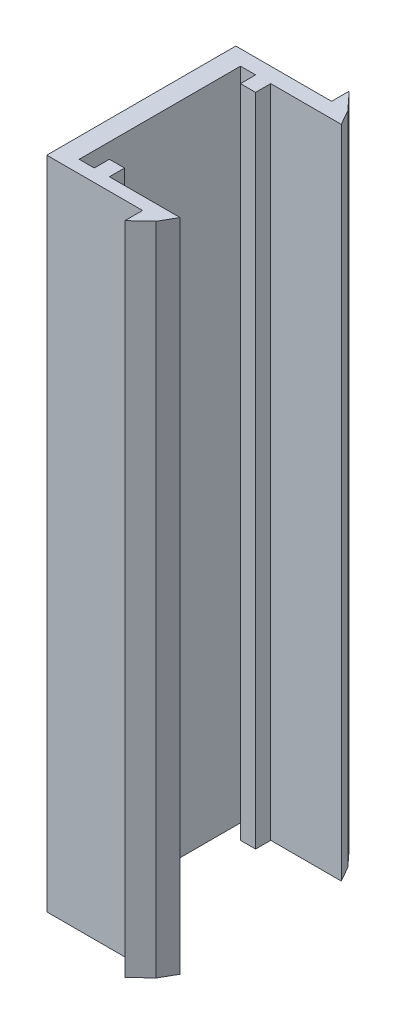
ISO-10303-21;
HEADER;
FILE_DESCRIPTION(('STEP AP214'),'2;1');
FILE_NAME('part.step','',(''),(''),'','','');
FILE_SCHEMA(('AUTOMOTIVE_DESIGN { 1 0 10303 214 1 1 1 1 }'));
ENDSEC;
DATA;
#1=APPLICATION_CONTEXT('core data for automotive mechanical design processes');
#2=APPLICATION_PROTOCOL_DEFINITION('international standard','automotive_design',2000,#1);
#3=PRODUCT_CONTEXT('',#1,'mechanical');
#4=PRODUCT('Part','Part','',(#3));
#5=PRODUCT_RELATED_PRODUCT_CATEGORY('part','',(#4));
#6=PRODUCT_DEFINITION_FORMATION('','',#4);
#7=PRODUCT_DEFINITION_CONTEXT('part definition',#1,'design');
#8=PRODUCT_DEFINITION('design','',#6,#7);
#9=PRODUCT_DEFINITION_SHAPE('','',#8);
#10=(LENGTH_UNIT() NAMED_UNIT(*) SI_UNIT(.MILLI.,.METRE.));
#11=(NAMED_UNIT(*) PLANE_ANGLE_UNIT() SI_UNIT($,.RADIAN.));
#12=(NAMED_UNIT(*) SI_UNIT($,.STERADIAN.) SOLID_ANGLE_UNIT());
#13=UNCERTAINTY_MEASURE_WITH_UNIT(LENGTH_MEASURE(1.E-05),#10,'distance_accuracy_value','');
#14=(GEOMETRIC_REPRESENTATION_CONTEXT(3) GLOBAL_UNCERTAINTY_ASSIGNED_CONTEXT((#13)) GLOBAL_UNIT_ASSIGNED_CONTEXT((#10,
#11,#12)) REPRESENTATION_CONTEXT('',''));
#15=CARTESIAN_POINT('',(0.,0.,0.));
#16=DIRECTION('',(0.,0.,1.));
#17=DIRECTION('',(1.,0.,0.));
#18=AXIS2_PLACEMENT_3D('',#15,#16,#17);
#19=CARTESIAN_POINT('',(3.,130.,-29.));
#20=DIRECTION('',(1.,0.,0.));
#21=DIRECTION('',(0.,0.,-1.));
#22=AXIS2_PLACEMENT_3D('',#19,#20,#21);
#23=PLANE('',#22);
#24=DIRECTION('',(0.,0.,1.));
#25=VECTOR('',#24,1.);
#26=CARTESIAN_POINT('',(3.,0.,-29.));
#27=LINE('',#26,#25);
#28=CARTESIAN_POINT('',(3.,0.,-29.));
#29=VERTEX_POINT('',#28);
#30=CARTESIAN_POINT('',(3.,0.,-26.));
#31=VERTEX_POINT('',#30);
#32=EDGE_CURVE('E203',#29,#31,#27,.T.);
#33=ORIENTED_EDGE('',*,*,#32,.T.);
#34=DIRECTION('',(0.,-1.,0.));
#35=VECTOR('',#34,1.);
#36=CARTESIAN_POINT('',(3.,130.,-26.));
#37=LINE('',#36,#35);
#38=CARTESIAN_POINT('',(3.,130.,-26.));
#39=VERTEX_POINT('',#38);
#40=EDGE_CURVE('E11',#39,#31,#37,.T.);
#41=ORIENTED_EDGE('',*,*,#40,.F.);
#42=DIRECTION('',(0.,0.,1.));
#43=VECTOR('',#42,1.);
#44=CARTESIAN_POINT('',(3.,130.,-29.));
#45=LINE('',#44,#43);
#46=CARTESIAN_POINT('',(3.,130.,-29.));
#47=VERTEX_POINT('',#46);
#48=EDGE_CURVE('E241',#47,#39,#45,.T.);
#49=ORIENTED_EDGE('',*,*,#48,.F.);
#50=DIRECTION('',(0.,-1.,0.));
#51=VECTOR('',#50,1.);
#52=CARTESIAN_POINT('',(3.,130.,-29.));
#53=LINE('',#52,#51);
#54=EDGE_CURVE('E199',#47,#29,#53,.T.);
#55=ORIENTED_EDGE('',*,*,#54,.T.);
#56=EDGE_LOOP('',(#33,#41,#49,#55));
#57=FACE_BOUND('',#56,.T.);
#58=ADVANCED_FACE('F35',(#57),#23,.F.);
#59=CARTESIAN_POINT('',(3.,130.,-26.));
#60=DIRECTION('',(0.,0.,-1.));
#61=DIRECTION('',(-1.,0.,0.));
#62=AXIS2_PLACEMENT_3D('',#59,#60,#61);
#63=PLANE('',#62);
#64=DIRECTION('',(1.,0.,0.));
#65=VECTOR('',#64,1.);
#66=CARTESIAN_POINT('',(3.,0.,-26.));
#67=LINE('',#66,#65);
#68=CARTESIAN_POINT('',(6.,0.,-26.));
#69=VERTEX_POINT('',#68);
#70=EDGE_CURVE('E206',#31,#69,#67,.T.);
#71=ORIENTED_EDGE('',*,*,#70,.T.);
#72=DIRECTION('',(0.,-1.,0.));
#73=VECTOR('',#72,1.);
#74=CARTESIAN_POINT('',(6.,130.,-26.));
#75=LINE('',#74,#73);
#76=CARTESIAN_POINT('',(6.,130.,-26.));
#77=VERTEX_POINT('',#76);
#78=EDGE_CURVE('E43',#77,#69,#75,.T.);
#79=ORIENTED_EDGE('',*,*,#78,.F.);
#80=DIRECTION('',(1.,0.,0.));
#81=VECTOR('',#80,1.);
#82=CARTESIAN_POINT('',(3.,130.,-26.));
#83=LINE('',#82,#81);
#84=EDGE_CURVE('E130',#39,#77,#83,.T.);
#85=ORIENTED_EDGE('',*,*,#84,.F.);
#86=ORIENTED_EDGE('',*,*,#40,.T.);
#87=EDGE_LOOP('',(#71,#79,#85,#86));
#88=FACE_BOUND('',#87,.T.);
#89=ADVANCED_FACE('F359',(#88),#63,.F.);
#90=CARTESIAN_POINT('',(6.,130.,-26.));
#91=DIRECTION('',(-1.,0.,0.));
#92=DIRECTION('',(0.,0.,1.));
#93=AXIS2_PLACEMENT_3D('',#90,#91,#92);
#94=PLANE('',#93);
#95=DIRECTION('',(0.,0.,-1.));
#96=VECTOR('',#95,1.);
#97=CARTESIAN_POINT('',(6.,0.,-26.));
#98=LINE('',#97,#96);
#99=CARTESIAN_POINT('',(6.,0.,-29.));
#100=VERTEX_POINT('',#99);
#101=EDGE_CURVE('E208',#69,#100,#98,.T.);
#102=ORIENTED_EDGE('',*,*,#101,.T.);
#103=DIRECTION('',(0.,-1.,0.));
#104=VECTOR('',#103,1.);
#105=CARTESIAN_POINT('',(6.,130.,-29.));
#106=LINE('',#105,#104);
#107=CARTESIAN_POINT('',(6.,130.,-29.));
#108=VERTEX_POINT('',#107);
#109=EDGE_CURVE('E284',#108,#100,#106,.T.);
#110=ORIENTED_EDGE('',*,*,#109,.F.);
#111=DIRECTION('',(0.,0.,-1.));
#112=VECTOR('',#111,1.);
#113=CARTESIAN_POINT('',(6.,130.,-26.));
#114=LINE('',#113,#112);
#115=EDGE_CURVE('E292',#77,#108,#114,.T.);
#116=ORIENTED_EDGE('',*,*,#115,.F.);
#117=ORIENTED_EDGE('',*,*,#78,.T.);
#118=EDGE_LOOP('',(#102,#110,#116,#117));
#119=FACE_BOUND('',#118,.T.);
#120=ADVANCED_FACE('F290',(#119),#94,.F.);
#121=CARTESIAN_POINT('',(6.,130.,-29.));
#122=DIRECTION('',(0.,0.,-1.));
#123=DIRECTION('',(-1.,0.,0.));
#124=AXIS2_PLACEMENT_3D('',#121,#122,#123);
#125=PLANE('',#124);
#126=DIRECTION('',(1.,0.,0.));
#127=VECTOR('',#126,1.);
#128=CARTESIAN_POINT('',(6.,0.,-29.));
#129=LINE('',#128,#127);
#130=CARTESIAN_POINT('',(20.,0.,-29.));
#131=VERTEX_POINT('',#130);
#132=EDGE_CURVE('E210',#100,#131,#129,.T.);
#133=ORIENTED_EDGE('',*,*,#132,.T.);
#134=DIRECTION('',(0.,-1.,0.));
#135=VECTOR('',#134,1.);
#136=CARTESIAN_POINT('',(20.,130.,-29.));
#137=LINE('',#136,#135);
#138=CARTESIAN_POINT('',(20.,130.,-29.));
#139=VERTEX_POINT('',#138);
#140=EDGE_CURVE('E281',#139,#131,#137,.T.);
#141=ORIENTED_EDGE('',*,*,#140,.F.);
#142=DIRECTION('',(1.,0.,0.));
#143=VECTOR('',#142,1.);
#144=CARTESIAN_POINT('',(6.,130.,-29.));
#145=LINE('',#144,#143);
#146=EDGE_CURVE('E310',#108,#139,#145,.T.);
#147=ORIENTED_EDGE('',*,*,#146,.F.);
#148=ORIENTED_EDGE('',*,*,#109,.T.);
#149=EDGE_LOOP('',(#133,#141,#147,#148));
#150=FACE_BOUND('',#149,.T.);
#151=ADVANCED_FACE('F301',(#150),#125,.F.);
#152=CARTESIAN_POINT('',(18.2906223594552,130.,-32.));
#153=DIRECTION('',(-0.868854805469174,0.,0.495066992449631));
#154=DIRECTION('',(0.495066992449631,0.,0.868854805469174));
#155=AXIS2_PLACEMENT_3D('',#152,#153,#154);
#156=PLANE('',#155);
#157=DIRECTION('',(-0.495066992449631,0.,-0.868854805469174));
#158=VECTOR('',#157,1.);
#159=CARTESIAN_POINT('',(18.2906223594552,0.,-32.));
#160=LINE('',#159,#158);
#161=CARTESIAN_POINT('',(18.2906223594552,0.,-32.));
#162=VERTEX_POINT('',#161);
#163=EDGE_CURVE('E212',#131,#162,#160,.T.);
#164=ORIENTED_EDGE('',*,*,#163,.T.);
#165=DIRECTION('',(0.,-1.,0.));
#166=VECTOR('',#165,1.);
#167=CARTESIAN_POINT('',(18.2906223594552,130.,-32.));
#168=LINE('',#167,#166);
#169=CARTESIAN_POINT('',(18.2906223594552,130.,-32.));
#170=VERTEX_POINT('',#169);
#171=EDGE_CURVE('E278',#170,#162,#168,.T.);
#172=ORIENTED_EDGE('',*,*,#171,.F.);
#173=DIRECTION('',(-0.495066992449631,0.,-0.868854805469174));
#174=VECTOR('',#173,1.);
#175=CARTESIAN_POINT('',(18.2906223594552,130.,-32.));
#176=LINE('',#175,#174);
#177=EDGE_CURVE('E307',#139,#170,#176,.T.);
#178=ORIENTED_EDGE('',*,*,#177,.F.);
#179=ORIENTED_EDGE('',*,*,#140,.T.);
#180=EDGE_LOOP('',(#164,#172,#178,#179));
#181=FACE_BOUND('',#180,.T.);
#182=ADVANCED_FACE('F305',(#181),#156,.F.);
#183=CARTESIAN_POINT('',(15.0753550566551,130.,-35.5));
#184=DIRECTION('',(-0.736426986320433,0.,0.676517031433063));
#185=DIRECTION('',(0.676517031433063,0.,0.736426986320433));
#186=AXIS2_PLACEMENT_3D('',#183,#184,#185);
#187=PLANE('',#186);
#188=DIRECTION('',(-0.676517031433063,0.,-0.736426986320433));
#189=VECTOR('',#188,1.);
#190=CARTESIAN_POINT('',(15.0753550566551,0.,-35.5));
#191=LINE('',#190,#189);
#192=CARTESIAN_POINT('',(15.0753550566551,0.,-35.5));
#193=VERTEX_POINT('',#192);
#194=EDGE_CURVE('E214',#162,#193,#191,.T.);
#195=ORIENTED_EDGE('',*,*,#194,.T.);
#196=DIRECTION('',(0.,-1.,0.));
#197=VECTOR('',#196,1.);
#198=CARTESIAN_POINT('',(15.0753550566551,130.,-35.5));
#199=LINE('',#198,#197);
#200=CARTESIAN_POINT('',(15.0753550566551,130.,-35.5));
#201=VERTEX_POINT('',#200);
#202=EDGE_CURVE('E275',#201,#193,#199,.T.);
#203=ORIENTED_EDGE('',*,*,#202,.F.);
#204=DIRECTION('',(-0.676517031433063,0.,-0.736426986320433));
#205=VECTOR('',#204,1.);
#206=CARTESIAN_POINT('',(15.0753550566551,130.,-35.5));
#207=LINE('',#206,#205);
#208=EDGE_CURVE('E309',#170,#201,#207,.T.);
#209=ORIENTED_EDGE('',*,*,#208,.F.);
#210=ORIENTED_EDGE('',*,*,#171,.T.);
#211=EDGE_LOOP('',(#195,#203,#209,#210));
#212=FACE_BOUND('',#211,.T.);
#213=ADVANCED_FACE('F372',(#212),#187,.F.);
#214=CARTESIAN_POINT('',(15.0753550566551,130.,-32.));
#215=DIRECTION('',(1.,0.,0.));
#216=DIRECTION('',(0.,0.,-1.));
#217=AXIS2_PLACEMENT_3D('',#214,#215,#216);
#218=PLANE('',#217);
#219=DIRECTION('',(0.,0.,1.));
#220=VECTOR('',#219,1.);
#221=CARTESIAN_POINT('',(15.0753550566551,0.,-32.));
#222=LINE('',#221,#220);
#223=CARTESIAN_POINT('',(15.0753550566551,0.,-32.));
#224=VERTEX_POINT('',#223);
#225=EDGE_CURVE('E216',#193,#224,#222,.T.);
#226=ORIENTED_EDGE('',*,*,#225,.T.);
#227=DIRECTION('',(0.,-1.,0.));
#228=VECTOR('',#227,1.);
#229=CARTESIAN_POINT('',(15.0753550566551,130.,-32.));
#230=LINE('',#229,#228);
#231=CARTESIAN_POINT('',(15.0753550566551,130.,-32.));
#232=VERTEX_POINT('',#231);
#233=EDGE_CURVE('E272',#232,#224,#230,.T.);
#234=ORIENTED_EDGE('',*,*,#233,.F.);
#235=DIRECTION('',(0.,0.,1.));
#236=VECTOR('',#235,1.);
#237=CARTESIAN_POINT('',(15.0753550566551,130.,-32.));
#238=LINE('',#237,#236);
#239=EDGE_CURVE('E312',#201,#232,#238,.T.);
#240=ORIENTED_EDGE('',*,*,#239,.F.);
#241=ORIENTED_EDGE('',*,*,#202,.T.);
#242=EDGE_LOOP('',(#226,#234,#240,#241));
#243=FACE_BOUND('',#242,.T.);
#244=ADVANCED_FACE('F375',(#243),#218,.F.);
#245=CARTESIAN_POINT('',(-3.92464494334491,130.,-32.));
#246=DIRECTION('',(0.,0.,1.));
#247=DIRECTION('',(1.,0.,0.));
#248=AXIS2_PLACEMENT_3D('',#245,#246,#247);
#249=PLANE('',#248);
#250=DIRECTION('',(-1.,0.,0.));
#251=VECTOR('',#250,1.);
#252=CARTESIAN_POINT('',(-3.92464494334491,0.,-32.));
#253=LINE('',#252,#251);
#254=CARTESIAN_POINT('',(-3.92464494334491,0.,-32.));
#255=VERTEX_POINT('',#254);
#256=EDGE_CURVE('E218',#224,#255,#253,.T.);
#257=ORIENTED_EDGE('',*,*,#256,.T.);
#258=DIRECTION('',(0.,-1.,0.));
#259=VECTOR('',#258,1.);
#260=CARTESIAN_POINT('',(-3.92464494334491,130.,-32.));
#261=LINE('',#260,#259);
#262=CARTESIAN_POINT('',(-3.92464494334491,130.,-32.));
#263=VERTEX_POINT('',#262);
#264=EDGE_CURVE('E269',#263,#255,#261,.T.);
#265=ORIENTED_EDGE('',*,*,#264,.F.);
#266=DIRECTION('',(-1.,0.,0.));
#267=VECTOR('',#266,1.);
#268=CARTESIAN_POINT('',(-3.92464494334491,130.,-32.));
#269=LINE('',#268,#267);
#270=EDGE_CURVE('E318',#232,#263,#269,.T.);
#271=ORIENTED_EDGE('',*,*,#270,.F.);
#272=ORIENTED_EDGE('',*,*,#233,.T.);
#273=EDGE_LOOP('',(#257,#265,#271,#272));
#274=FACE_BOUND('',#273,.T.);
#275=ADVANCED_FACE('F379',(#274),#249,.F.);
#276=CARTESIAN_POINT('',(-3.92464494334491,130.,5.5));
#277=DIRECTION('',(1.,0.,0.));
#278=DIRECTION('',(0.,0.,-1.));
#279=AXIS2_PLACEMENT_3D('',#276,#277,#278);
#280=PLANE('',#279);
#281=DIRECTION('',(0.,0.,1.));
#282=VECTOR('',#281,1.);
#283=CARTESIAN_POINT('',(-3.92464494334491,0.,5.5));
#284=LINE('',#283,#282);
#285=CARTESIAN_POINT('',(-3.92464494334491,0.,5.5));
#286=VERTEX_POINT('',#285);
#287=EDGE_CURVE('E220',#255,#286,#284,.T.);
#288=ORIENTED_EDGE('',*,*,#287,.T.);
#289=DIRECTION('',(0.,-1.,0.));
#290=VECTOR('',#289,1.);
#291=CARTESIAN_POINT('',(-3.92464494334491,130.,5.5));
#292=LINE('',#291,#290);
#293=CARTESIAN_POINT('',(-3.92464494334491,130.,5.5));
#294=VERTEX_POINT('',#293);
#295=EDGE_CURVE('E266',#294,#286,#292,.T.);
#296=ORIENTED_EDGE('',*,*,#295,.F.);
#297=DIRECTION('',(0.,0.,1.));
#298=VECTOR('',#297,1.);
#299=CARTESIAN_POINT('',(-3.92464494334491,130.,5.5));
#300=LINE('',#299,#298);
#301=EDGE_CURVE('E320',#263,#294,#300,.T.);
#302=ORIENTED_EDGE('',*,*,#301,.F.);
#303=ORIENTED_EDGE('',*,*,#264,.T.);
#304=EDGE_LOOP('',(#288,#296,#302,#303));
#305=FACE_BOUND('',#304,.T.);
#306=ADVANCED_FACE('F383',(#305),#280,.F.);
#307=CARTESIAN_POINT('',(-3.92464494334491,130.,5.5));
#308=DIRECTION('',(0.,0.,-1.));
#309=DIRECTION('',(-1.,0.,0.));
#310=AXIS2_PLACEMENT_3D('',#307,#308,#309);
#311=PLANE('',#310);
#312=DIRECTION('',(1.,0.,0.));
#313=VECTOR('',#312,1.);
#314=CARTESIAN_POINT('',(-3.92464494334491,0.,5.5));
#315=LINE('',#314,#313);
#316=CARTESIAN_POINT('',(15.0753550566551,0.,5.5));
#317=VERTEX_POINT('',#316);
#318=EDGE_CURVE('E222',#286,#317,#315,.T.);
#319=ORIENTED_EDGE('',*,*,#318,.T.);
#320=DIRECTION('',(0.,-1.,0.));
#321=VECTOR('',#320,1.);
#322=CARTESIAN_POINT('',(15.0753550566551,130.,5.5));
#323=LINE('',#322,#321);
#324=CARTESIAN_POINT('',(15.0753550566551,130.,5.5));
#325=VERTEX_POINT('',#324);
#326=EDGE_CURVE('E263',#325,#317,#323,.T.);
#327=ORIENTED_EDGE('',*,*,#326,.F.);
#328=DIRECTION('',(1.,0.,0.));
#329=VECTOR('',#328,1.);
#330=CARTESIAN_POINT('',(-3.92464494334491,130.,5.5));
#331=LINE('',#330,#329);
#332=EDGE_CURVE('E322',#294,#325,#331,.T.);
#333=ORIENTED_EDGE('',*,*,#332,.F.);
#334=ORIENTED_EDGE('',*,*,#295,.T.);
#335=EDGE_LOOP('',(#319,#327,#333,#334));
#336=FACE_BOUND('',#335,.T.);
#337=ADVANCED_FACE('F387',(#336),#311,.F.);
#338=CARTESIAN_POINT('',(15.0753550566551,130.,5.5));
#339=DIRECTION('',(1.,0.,0.));
#340=DIRECTION('',(0.,0.,-1.));
#341=AXIS2_PLACEMENT_3D('',#338,#339,#340);
#342=PLANE('',#341);
#343=DIRECTION('',(0.,0.,1.));
#344=VECTOR('',#343,1.);
#345=CARTESIAN_POINT('',(15.0753550566551,0.,5.5));
#346=LINE('',#345,#344);
#347=CARTESIAN_POINT('',(15.0753550566551,0.,9.));
#348=VERTEX_POINT('',#347);
#349=EDGE_CURVE('E224',#317,#348,#346,.T.);
#350=ORIENTED_EDGE('',*,*,#349,.T.);
#351=DIRECTION('',(0.,-1.,0.));
#352=VECTOR('',#351,1.);
#353=CARTESIAN_POINT('',(15.0753550566551,130.,9.));
#354=LINE('',#353,#352);
#355=CARTESIAN_POINT('',(15.0753550566551,130.,9.));
#356=VERTEX_POINT('',#355);
#357=EDGE_CURVE('E260',#356,#348,#354,.T.);
#358=ORIENTED_EDGE('',*,*,#357,.F.);
#359=DIRECTION('',(0.,0.,1.));
#360=VECTOR('',#359,1.);
#361=CARTESIAN_POINT('',(15.0753550566551,130.,5.5));
#362=LINE('',#361,#360);
#363=EDGE_CURVE('E324',#325,#356,#362,.T.);
#364=ORIENTED_EDGE('',*,*,#363,.F.);
#365=ORIENTED_EDGE('',*,*,#326,.T.);
#366=EDGE_LOOP('',(#350,#358,#364,#365));
#367=FACE_BOUND('',#366,.T.);
#368=ADVANCED_FACE('F391',(#367),#342,.F.);
#369=CARTESIAN_POINT('',(15.0753550566551,130.,9.));
#370=DIRECTION('',(-0.682206899804954,0.,-0.731159179562504));
#371=DIRECTION('',(-0.731159179562504,0.,0.682206899804954));
#372=AXIS2_PLACEMENT_3D('',#369,#370,#371);
#373=PLANE('',#372);
#374=DIRECTION('',(0.731159179562504,0.,-0.682206899804954));
#375=VECTOR('',#374,1.);
#376=CARTESIAN_POINT('',(15.0753550566551,0.,9.));
#377=LINE('',#376,#375);
#378=CARTESIAN_POINT('',(18.2906223594552,0.,6.));
#379=VERTEX_POINT('',#378);
#380=EDGE_CURVE('E226',#348,#379,#377,.T.);
#381=ORIENTED_EDGE('',*,*,#380,.T.);
#382=DIRECTION('',(0.,-1.,0.));
#383=VECTOR('',#382,1.);
#384=CARTESIAN_POINT('',(18.2906223594552,130.,6.));
#385=LINE('',#384,#383);
#386=CARTESIAN_POINT('',(18.2906223594552,130.,6.));
#387=VERTEX_POINT('',#386);
#388=EDGE_CURVE('E257',#387,#379,#385,.T.);
#389=ORIENTED_EDGE('',*,*,#388,.F.);
#390=DIRECTION('',(0.731159179562504,0.,-0.682206899804954));
#391=VECTOR('',#390,1.);
#392=CARTESIAN_POINT('',(15.0753550566551,130.,9.));
#393=LINE('',#392,#391);
#394=EDGE_CURVE('E326',#356,#387,#393,.T.);
#395=ORIENTED_EDGE('',*,*,#394,.F.);
#396=ORIENTED_EDGE('',*,*,#357,.T.);
#397=EDGE_LOOP('',(#381,#389,#395,#396));
#398=FACE_BOUND('',#397,.T.);
#399=ADVANCED_FACE('F395',(#398),#373,.F.);
#400=CARTESIAN_POINT('',(18.2906223594552,130.,6.));
#401=DIRECTION('',(-0.868854805469175,0.,-0.49506699244963));
#402=DIRECTION('',(-0.49506699244963,0.,0.868854805469175));
#403=AXIS2_PLACEMENT_3D('',#400,#401,#402);
#404=PLANE('',#403);
#405=DIRECTION('',(0.49506699244963,0.,-0.868854805469175));
#406=VECTOR('',#405,1.);
#407=CARTESIAN_POINT('',(18.2906223594552,0.,6.));
#408=LINE('',#407,#406);
#409=CARTESIAN_POINT('',(20.,0.,3.));
#410=VERTEX_POINT('',#409);
#411=EDGE_CURVE('E228',#379,#410,#408,.T.);
#412=ORIENTED_EDGE('',*,*,#411,.T.);
#413=DIRECTION('',(0.,-1.,0.));
#414=VECTOR('',#413,1.);
#415=CARTESIAN_POINT('',(20.,130.,3.));
#416=LINE('',#415,#414);
#417=CARTESIAN_POINT('',(20.,130.,3.));
#418=VERTEX_POINT('',#417);
#419=EDGE_CURVE('E254',#418,#410,#416,.T.);
#420=ORIENTED_EDGE('',*,*,#419,.F.);
#421=DIRECTION('',(0.49506699244963,0.,-0.868854805469175));
#422=VECTOR('',#421,1.);
#423=CARTESIAN_POINT('',(18.2906223594552,130.,6.));
#424=LINE('',#423,#422);
#425=EDGE_CURVE('E328',#387,#418,#424,.T.);
#426=ORIENTED_EDGE('',*,*,#425,.F.);
#427=ORIENTED_EDGE('',*,*,#388,.T.);
#428=EDGE_LOOP('',(#412,#420,#426,#427));
#429=FACE_BOUND('',#428,.T.);
#430=ADVANCED_FACE('F399',(#429),#404,.F.);
#431=CARTESIAN_POINT('',(6.,130.,3.));
#432=DIRECTION('',(0.,0.,1.));
#433=DIRECTION('',(1.,0.,0.));
#434=AXIS2_PLACEMENT_3D('',#431,#432,#433);
#435=PLANE('',#434);
#436=DIRECTION('',(-1.,0.,0.));
#437=VECTOR('',#436,1.);
#438=CARTESIAN_POINT('',(6.,0.,3.));
#439=LINE('',#438,#437);
#440=CARTESIAN_POINT('',(6.,0.,3.));
#441=VERTEX_POINT('',#440);
#442=EDGE_CURVE('E230',#410,#441,#439,.T.);
#443=ORIENTED_EDGE('',*,*,#442,.T.);
#444=DIRECTION('',(0.,-1.,0.));
#445=VECTOR('',#444,1.);
#446=CARTESIAN_POINT('',(6.,130.,3.));
#447=LINE('',#446,#445);
#448=CARTESIAN_POINT('',(6.,130.,3.));
#449=VERTEX_POINT('',#448);
#450=EDGE_CURVE('E251',#449,#441,#447,.T.);
#451=ORIENTED_EDGE('',*,*,#450,.F.);
#452=DIRECTION('',(-1.,0.,0.));
#453=VECTOR('',#452,1.);
#454=CARTESIAN_POINT('',(6.,130.,3.));
#455=LINE('',#454,#453);
#456=EDGE_CURVE('E330',#418,#449,#455,.T.);
#457=ORIENTED_EDGE('',*,*,#456,.F.);
#458=ORIENTED_EDGE('',*,*,#419,.T.);
#459=EDGE_LOOP('',(#443,#451,#457,#458));
#460=FACE_BOUND('',#459,.T.);
#461=ADVANCED_FACE('F403',(#460),#435,.F.);
#462=CARTESIAN_POINT('',(6.,130.,0.));
#463=DIRECTION('',(-1.,0.,0.));
#464=DIRECTION('',(0.,0.,1.));
#465=AXIS2_PLACEMENT_3D('',#462,#463,#464);
#466=PLANE('',#465);
#467=DIRECTION('',(0.,0.,-1.));
#468=VECTOR('',#467,1.);
#469=CARTESIAN_POINT('',(6.,0.,0.));
#470=LINE('',#469,#468);
#471=CARTESIAN_POINT('',(6.,0.,0.));
#472=VERTEX_POINT('',#471);
#473=EDGE_CURVE('E232',#441,#472,#470,.T.);
#474=ORIENTED_EDGE('',*,*,#473,.T.);
#475=DIRECTION('',(0.,-1.,0.));
#476=VECTOR('',#475,1.);
#477=CARTESIAN_POINT('',(6.,130.,0.));
#478=LINE('',#477,#476);
#479=CARTESIAN_POINT('',(6.,130.,0.));
#480=VERTEX_POINT('',#479);
#481=EDGE_CURVE('E248',#480,#472,#478,.T.);
#482=ORIENTED_EDGE('',*,*,#481,.F.);
#483=DIRECTION('',(0.,0.,-1.));
#484=VECTOR('',#483,1.);
#485=CARTESIAN_POINT('',(6.,130.,0.));
#486=LINE('',#485,#484);
#487=EDGE_CURVE('E332',#449,#480,#486,.T.);
#488=ORIENTED_EDGE('',*,*,#487,.F.);
#489=ORIENTED_EDGE('',*,*,#450,.T.);
#490=EDGE_LOOP('',(#474,#482,#488,#489));
#491=FACE_BOUND('',#490,.T.);
#492=ADVANCED_FACE('F407',(#491),#466,.F.);
#493=CARTESIAN_POINT('',(3.,130.,0.));
#494=DIRECTION('',(0.,0.,1.));
#495=DIRECTION('',(1.,0.,0.));
#496=AXIS2_PLACEMENT_3D('',#493,#494,#495);
#497=PLANE('',#496);
#498=DIRECTION('',(-1.,0.,0.));
#499=VECTOR('',#498,1.);
#500=CARTESIAN_POINT('',(3.,0.,0.));
#501=LINE('',#500,#499);
#502=CARTESIAN_POINT('',(3.,0.,0.));
#503=VERTEX_POINT('',#502);
#504=EDGE_CURVE('E234',#472,#503,#501,.T.);
#505=ORIENTED_EDGE('',*,*,#504,.T.);
#506=DIRECTION('',(0.,-1.,0.));
#507=VECTOR('',#506,1.);
#508=CARTESIAN_POINT('',(3.,130.,0.));
#509=LINE('',#508,#507);
#510=CARTESIAN_POINT('',(3.,130.,0.));
#511=VERTEX_POINT('',#510);
#512=EDGE_CURVE('E245',#511,#503,#509,.T.);
#513=ORIENTED_EDGE('',*,*,#512,.F.);
#514=DIRECTION('',(-1.,0.,0.));
#515=VECTOR('',#514,1.);
#516=CARTESIAN_POINT('',(3.,130.,0.));
#517=LINE('',#516,#515);
#518=EDGE_CURVE('E334',#480,#511,#517,.T.);
#519=ORIENTED_EDGE('',*,*,#518,.F.);
#520=ORIENTED_EDGE('',*,*,#481,.T.);
#521=EDGE_LOOP('',(#505,#513,#519,#520));
#522=FACE_BOUND('',#521,.T.);
#523=ADVANCED_FACE('F340',(#522),#497,.F.);
#524=CARTESIAN_POINT('',(3.,130.,3.));
#525=DIRECTION('',(1.,0.,0.));
#526=DIRECTION('',(0.,0.,-1.));
#527=AXIS2_PLACEMENT_3D('',#524,#525,#526);
#528=PLANE('',#527);
#529=DIRECTION('',(0.,0.,1.));
#530=VECTOR('',#529,1.);
#531=CARTESIAN_POINT('',(3.,0.,3.));
#532=LINE('',#531,#530);
#533=CARTESIAN_POINT('',(3.,0.,3.));
#534=VERTEX_POINT('',#533);
#535=EDGE_CURVE('E236',#503,#534,#532,.T.);
#536=ORIENTED_EDGE('',*,*,#535,.T.);
#537=DIRECTION('',(0.,-1.,0.));
#538=VECTOR('',#537,1.);
#539=CARTESIAN_POINT('',(3.,130.,3.));
#540=LINE('',#539,#538);
#541=CARTESIAN_POINT('',(3.,130.,3.));
#542=VERTEX_POINT('',#541);
#543=EDGE_CURVE('E194',#542,#534,#540,.T.);
#544=ORIENTED_EDGE('',*,*,#543,.F.);
#545=DIRECTION('',(0.,0.,1.));
#546=VECTOR('',#545,1.);
#547=CARTESIAN_POINT('',(3.,130.,3.));
#548=LINE('',#547,#546);
#549=EDGE_CURVE('E185',#511,#542,#548,.T.);
#550=ORIENTED_EDGE('',*,*,#549,.F.);
#551=ORIENTED_EDGE('',*,*,#512,.T.);
#552=EDGE_LOOP('',(#536,#544,#550,#551));
#553=FACE_BOUND('',#552,.T.);
#554=ADVANCED_FACE('F344',(#553),#528,.F.);
#555=CARTESIAN_POINT('',(0.,130.,3.));
#556=DIRECTION('',(0.,0.,1.));
#557=DIRECTION('',(1.,0.,0.));
#558=AXIS2_PLACEMENT_3D('',#555,#556,#557);
#559=PLANE('',#558);
#560=DIRECTION('',(-1.,0.,0.));
#561=VECTOR('',#560,1.);
#562=CARTESIAN_POINT('',(0.,0.,3.));
#563=LINE('',#562,#561);
#564=CARTESIAN_POINT('',(0.,0.,3.));
#565=VERTEX_POINT('',#564);
#566=EDGE_CURVE('E193',#534,#565,#563,.T.);
#567=ORIENTED_EDGE('',*,*,#566,.T.);
#568=DIRECTION('',(0.,-1.,0.));
#569=VECTOR('',#568,1.);
#570=CARTESIAN_POINT('',(0.,130.,3.));
#571=LINE('',#570,#569);
#572=CARTESIAN_POINT('',(0.,130.,3.));
#573=VERTEX_POINT('',#572);
#574=EDGE_CURVE('E190',#573,#565,#571,.T.);
#575=ORIENTED_EDGE('',*,*,#574,.F.);
#576=DIRECTION('',(-1.,0.,0.));
#577=VECTOR('',#576,1.);
#578=CARTESIAN_POINT('',(0.,130.,3.));
#579=LINE('',#578,#577);
#580=EDGE_CURVE('E179',#542,#573,#579,.T.);
#581=ORIENTED_EDGE('',*,*,#580,.F.);
#582=ORIENTED_EDGE('',*,*,#543,.T.);
#583=EDGE_LOOP('',(#567,#575,#581,#582));
#584=FACE_BOUND('',#583,.T.);
#585=ADVANCED_FACE('F191',(#584),#559,.F.);
#586=CARTESIAN_POINT('',(0.,130.,3.));
#587=DIRECTION('',(-1.,0.,0.));
#588=DIRECTION('',(0.,0.,1.));
#589=AXIS2_PLACEMENT_3D('',#586,#587,#588);
#590=PLANE('',#589);
#591=DIRECTION('',(0.,0.,-1.));
#592=VECTOR('',#591,1.);
#593=CARTESIAN_POINT('',(0.,0.,3.));
#594=LINE('',#593,#592);
#595=CARTESIAN_POINT('',(0.,0.,-29.));
#596=VERTEX_POINT('',#595);
#597=EDGE_CURVE('E116',#565,#596,#594,.T.);
#598=ORIENTED_EDGE('',*,*,#597,.T.);
#599=DIRECTION('',(0.,-1.,0.));
#600=VECTOR('',#599,1.);
#601=CARTESIAN_POINT('',(0.,130.,-29.));
#602=LINE('',#601,#600);
#603=CARTESIAN_POINT('',(0.,130.,-29.));
#604=VERTEX_POINT('',#603);
#605=EDGE_CURVE('E195',#604,#596,#602,.T.);
#606=ORIENTED_EDGE('',*,*,#605,.F.);
#607=DIRECTION('',(0.,0.,-1.));
#608=VECTOR('',#607,1.);
#609=CARTESIAN_POINT('',(0.,130.,3.));
#610=LINE('',#609,#608);
#611=EDGE_CURVE('E183',#573,#604,#610,.T.);
#612=ORIENTED_EDGE('',*,*,#611,.F.);
#613=ORIENTED_EDGE('',*,*,#574,.T.);
#614=EDGE_LOOP('',(#598,#606,#612,#613));
#615=FACE_BOUND('',#614,.T.);
#616=ADVANCED_FACE('F197',(#615),#590,.F.);
#617=CARTESIAN_POINT('',(0.,130.,-29.));
#618=DIRECTION('',(0.,0.,-1.));
#619=DIRECTION('',(-1.,0.,0.));
#620=AXIS2_PLACEMENT_3D('',#617,#618,#619);
#621=PLANE('',#620);
#622=DIRECTION('',(1.,0.,0.));
#623=VECTOR('',#622,1.);
#624=CARTESIAN_POINT('',(0.,0.,-29.));
#625=LINE('',#624,#623);
#626=EDGE_CURVE('E122',#596,#29,#625,.T.);
#627=ORIENTED_EDGE('',*,*,#626,.T.);
#628=ORIENTED_EDGE('',*,*,#54,.F.);
#629=DIRECTION('',(1.,0.,0.));
#630=VECTOR('',#629,1.);
#631=CARTESIAN_POINT('',(0.,130.,-29.));
#632=LINE('',#631,#630);
#633=EDGE_CURVE('E51',#604,#47,#632,.T.);
#634=ORIENTED_EDGE('',*,*,#633,.F.);
#635=ORIENTED_EDGE('',*,*,#605,.T.);
#636=EDGE_LOOP('',(#627,#628,#634,#635));
#637=FACE_BOUND('',#636,.T.);
#638=ADVANCED_FACE('F348',(#637),#621,.F.);
#639=CARTESIAN_POINT('',(0.,130.,0.));
#640=DIRECTION('',(0.,1.,0.));
#641=DIRECTION('',(0.,0.,1.));
#642=AXIS2_PLACEMENT_3D('',#639,#640,#641);
#643=PLANE('',#642);
#644=ORIENTED_EDGE('',*,*,#48,.T.);
#645=ORIENTED_EDGE('',*,*,#84,.T.);
#646=ORIENTED_EDGE('',*,*,#115,.T.);
#647=ORIENTED_EDGE('',*,*,#146,.T.);
#648=ORIENTED_EDGE('',*,*,#177,.T.);
#649=ORIENTED_EDGE('',*,*,#208,.T.);
#650=ORIENTED_EDGE('',*,*,#239,.T.);
#651=ORIENTED_EDGE('',*,*,#270,.T.);
#652=ORIENTED_EDGE('',*,*,#301,.T.);
#653=ORIENTED_EDGE('',*,*,#332,.T.);
#654=ORIENTED_EDGE('',*,*,#363,.T.);
#655=ORIENTED_EDGE('',*,*,#394,.T.);
#656=ORIENTED_EDGE('',*,*,#425,.T.);
#657=ORIENTED_EDGE('',*,*,#456,.T.);
#658=ORIENTED_EDGE('',*,*,#487,.T.);
#659=ORIENTED_EDGE('',*,*,#518,.T.);
#660=ORIENTED_EDGE('',*,*,#549,.T.);
#661=ORIENTED_EDGE('',*,*,#580,.T.);
#662=ORIENTED_EDGE('',*,*,#611,.T.);
#663=ORIENTED_EDGE('',*,*,#633,.T.);
#664=EDGE_LOOP('',(#644,#645,#646,#647,#648,#649,#650,#651,#652,#653,#654,#655,#656,#657,#658,
#659,#660,#661,#662,#663));
#665=FACE_BOUND('',#664,.T.);
#666=ADVANCED_FACE('F181',(#665),#643,.T.);
#667=CARTESIAN_POINT('',(0.,0.,0.));
#668=DIRECTION('',(0.,1.,0.));
#669=DIRECTION('',(0.,0.,1.));
#670=AXIS2_PLACEMENT_3D('',#667,#668,#669);
#671=PLANE('',#670);
#672=ORIENTED_EDGE('',*,*,#32,.F.);
#673=ORIENTED_EDGE('',*,*,#626,.F.);
#674=ORIENTED_EDGE('',*,*,#597,.F.);
#675=ORIENTED_EDGE('',*,*,#566,.F.);
#676=ORIENTED_EDGE('',*,*,#535,.F.);
#677=ORIENTED_EDGE('',*,*,#504,.F.);
#678=ORIENTED_EDGE('',*,*,#473,.F.);
#679=ORIENTED_EDGE('',*,*,#442,.F.);
#680=ORIENTED_EDGE('',*,*,#411,.F.);
#681=ORIENTED_EDGE('',*,*,#380,.F.);
#682=ORIENTED_EDGE('',*,*,#349,.F.);
#683=ORIENTED_EDGE('',*,*,#318,.F.);
#684=ORIENTED_EDGE('',*,*,#287,.F.);
#685=ORIENTED_EDGE('',*,*,#256,.F.);
#686=ORIENTED_EDGE('',*,*,#225,.F.);
#687=ORIENTED_EDGE('',*,*,#194,.F.);
#688=ORIENTED_EDGE('',*,*,#163,.F.);
#689=ORIENTED_EDGE('',*,*,#132,.F.);
#690=ORIENTED_EDGE('',*,*,#101,.F.);
#691=ORIENTED_EDGE('',*,*,#70,.F.);
#692=EDGE_LOOP('',(#672,#673,#674,#675,#676,#677,#678,#679,#680,#681,#682,#683,#684,#685,#686,
#687,#688,#689,#690,#691));
#693=FACE_BOUND('',#692,.T.);
#694=ADVANCED_FACE('F296',(#693),#671,.F.);
#695=CLOSED_SHELL('',(#58,#89,#120,#151,#182,#213,#244,#275,#306,#337,#368,#399,#430,#461,#492,
#523,#554,#585,#616,#638,#666,#694));
#696=MANIFOLD_SOLID_BREP('B2',#695);
#697=ADVANCED_BREP_SHAPE_REPRESENTATION('',(#18,#696),#14);
#698=SHAPE_DEFINITION_REPRESENTATION(#9,#697);
ENDSEC;
END-ISO-10303-21;
